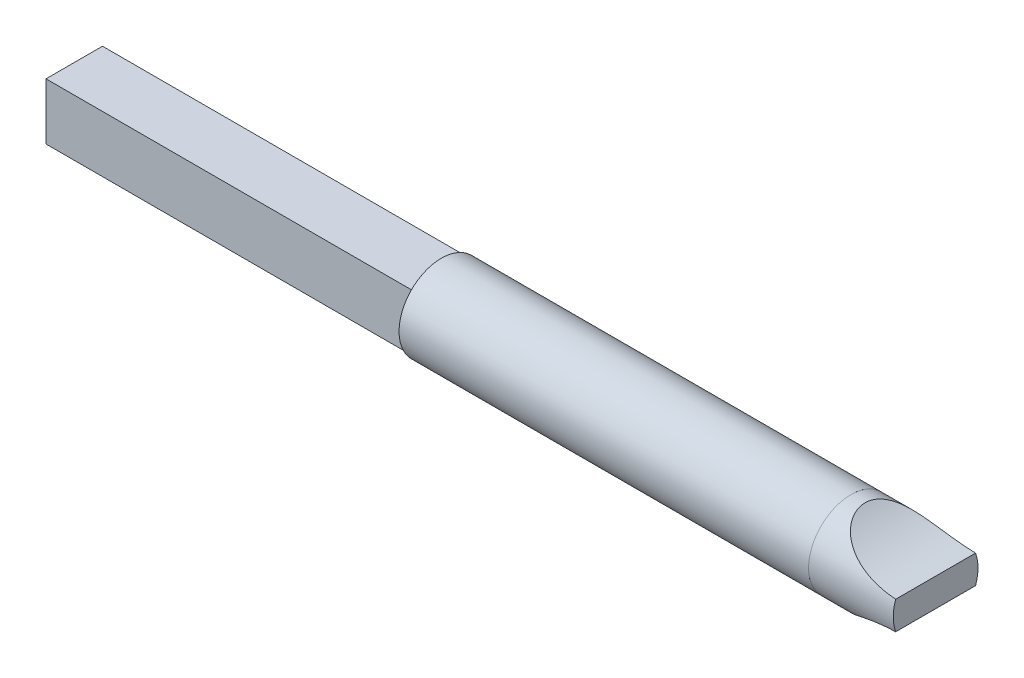
ISO-10303-21;
HEADER;
FILE_DESCRIPTION(('STEP AP214'),'2;1');
FILE_NAME('part.step','',(''),(''),'','','');
FILE_SCHEMA(('AUTOMOTIVE_DESIGN { 1 0 10303 214 1 1 1 1 }'));
ENDSEC;
DATA;
#1=APPLICATION_CONTEXT('core data for automotive mechanical design processes');
#2=APPLICATION_PROTOCOL_DEFINITION('international standard','automotive_design',2000,#1);
#3=PRODUCT_CONTEXT('',#1,'mechanical');
#4=PRODUCT('Part','Part','',(#3));
#5=PRODUCT_RELATED_PRODUCT_CATEGORY('part','',(#4));
#6=PRODUCT_DEFINITION_FORMATION('','',#4);
#7=PRODUCT_DEFINITION_CONTEXT('part definition',#1,'design');
#8=PRODUCT_DEFINITION('design','',#6,#7);
#9=PRODUCT_DEFINITION_SHAPE('','',#8);
#10=(LENGTH_UNIT() NAMED_UNIT(*) SI_UNIT(.MILLI.,.METRE.));
#11=(NAMED_UNIT(*) PLANE_ANGLE_UNIT() SI_UNIT($,.RADIAN.));
#12=(NAMED_UNIT(*) SI_UNIT($,.STERADIAN.) SOLID_ANGLE_UNIT());
#13=UNCERTAINTY_MEASURE_WITH_UNIT(LENGTH_MEASURE(1.E-05),#10,'distance_accuracy_value','');
#14=(GEOMETRIC_REPRESENTATION_CONTEXT(3) GLOBAL_UNCERTAINTY_ASSIGNED_CONTEXT((#13)) GLOBAL_UNIT_ASSIGNED_CONTEXT((#10,
#11,#12)) REPRESENTATION_CONTEXT('',''));
#15=CARTESIAN_POINT('',(0.,0.,0.));
#16=DIRECTION('',(0.,0.,1.));
#17=DIRECTION('',(1.,0.,0.));
#18=AXIS2_PLACEMENT_3D('',#15,#16,#17);
#19=CARTESIAN_POINT('',(65.,0.,0.));
#20=DIRECTION('',(1.,0.,0.));
#21=DIRECTION('',(0.,0.,-1.));
#22=AXIS2_PLACEMENT_3D('',#19,#20,#21);
#23=PLANE('',#22);
#24=CARTESIAN_POINT('',(65.,0.,0.));
#25=DIRECTION('',(1.,0.,0.));
#26=DIRECTION('',(0.,0.,-1.));
#27=AXIS2_PLACEMENT_3D('',#24,#25,#26);
#28=CIRCLE('',#27,3.);
#29=CARTESIAN_POINT('',(65.,0.999999999999999,2.82842712474619));
#30=VERTEX_POINT('',#29);
#31=CARTESIAN_POINT('',(65.,-0.999999999999999,2.82842712474619));
#32=VERTEX_POINT('',#31);
#33=EDGE_CURVE('E93',#30,#32,#28,.T.);
#34=ORIENTED_EDGE('',*,*,#33,.T.);
#35=DIRECTION('',(0.,0.,-1.));
#36=VECTOR('',#35,1.);
#37=CARTESIAN_POINT('',(65.,-0.999999999999999,16.7403810567666));
#38=LINE('',#37,#36);
#39=CARTESIAN_POINT('',(65.,-0.999999999999999,-2.82842712474619));
#40=VERTEX_POINT('',#39);
#41=EDGE_CURVE('E13',#32,#40,#38,.T.);
#42=ORIENTED_EDGE('',*,*,#41,.T.);
#43=CARTESIAN_POINT('',(65.,0.999999999999999,-2.82842712474619));
#44=VERTEX_POINT('',#43);
#45=EDGE_CURVE('E82',#40,#44,#28,.T.);
#46=ORIENTED_EDGE('',*,*,#45,.T.);
#47=DIRECTION('',(0.,0.,-1.));
#48=VECTOR('',#47,1.);
#49=CARTESIAN_POINT('',(65.,0.999999999999999,85.6895070311973));
#50=LINE('',#49,#48);
#51=EDGE_CURVE('E68',#30,#44,#50,.T.);
#52=ORIENTED_EDGE('',*,*,#51,.F.);
#53=EDGE_LOOP('',(#34,#42,#46,#52));
#54=FACE_BOUND('',#53,.T.);
#55=ADVANCED_FACE('F58',(#54),#23,.T.);
#56=CARTESIAN_POINT('',(65.,0.,0.));
#57=DIRECTION('',(-1.,0.,0.));
#58=DIRECTION('',(0.,0.,1.));
#59=AXIS2_PLACEMENT_3D('',#56,#57,#58);
#60=CYLINDRICAL_SURFACE('',#59,3.);
#61=CARTESIAN_POINT('',(59.,0.,0.));
#62=DIRECTION('',(1.,0.,0.));
#63=DIRECTION('',(0.,0.,-1.));
#64=AXIS2_PLACEMENT_3D('',#61,#62,#63);
#65=CIRCLE('',#64,3.);
#66=CARTESIAN_POINT('',(59.,0.,-3.));
#67=VERTEX_POINT('',#66);
#68=EDGE_CURVE('E63',#67,#67,#65,.T.);
#69=ORIENTED_EDGE('',*,*,#68,.T.);
#70=EDGE_LOOP('',(#69));
#71=FACE_BOUND('',#70,.T.);
#72=ORIENTED_EDGE('',*,*,#45,.F.);
#73=CARTESIAN_POINT('',(65.,-0.999999999999999,-2.82842712474619));
#74=CARTESIAN_POINT('',(64.8977227981435,-1.00380811025547,-2.82707086786133));
#75=CARTESIAN_POINT('',(64.795527259305,-1.00958177474734,-2.82503051619203));
#76=CARTESIAN_POINT('',(64.5914656067899,-1.0250405728982,-2.81946342968028));
#77=CARTESIAN_POINT('',(64.4895995183651,-1.03472599954653,-2.81593658349915));
#78=CARTESIAN_POINT('',(64.2861768446936,-1.05801115940411,-2.80726990181661));
#79=CARTESIAN_POINT('',(64.1846212730786,-1.07161861290351,-2.80212688314985));
#80=CARTESIAN_POINT('',(63.982220702239,-1.10270170833027,-2.79004006186386));
#81=CARTESIAN_POINT('',(63.8813756861871,-1.12017725833498,-2.78309630203733));
#82=CARTESIAN_POINT('',(63.5779497195673,-1.17877303856045,-2.75904421548047));
#83=CARTESIAN_POINT('',(63.3767122683805,-1.22580674736097,-2.73879983107694));
#84=CARTESIAN_POINT('',(62.9799304253088,-1.33483431406507,-2.68735141458544));
#85=CARTESIAN_POINT('',(62.7843801324206,-1.3968119967429,-2.65615921579512));
#86=CARTESIAN_POINT('',(62.4840466705774,-1.50471114043191,-2.59573219360949));
#87=CARTESIAN_POINT('',(62.3765706745318,-1.54599076847483,-2.57148072705159));
#88=CARTESIAN_POINT('',(62.1646848521842,-1.63260915278527,-2.51737990580141));
#89=CARTESIAN_POINT('',(62.0602750044021,-1.67794788060741,-2.48753059033616));
#90=CARTESIAN_POINT('',(61.8555373058913,-1.77201946969617,-2.42141281198766));
#91=CARTESIAN_POINT('',(61.7551963472498,-1.82073978526117,-2.38516737966097));
#92=CARTESIAN_POINT('',(61.5590357575676,-1.92099007929812,-2.30519056230202));
#93=CARTESIAN_POINT('',(61.4632148788322,-1.97251927385836,-2.26146125867886));
#94=CARTESIAN_POINT('',(61.2305281930951,-2.10366530034094,-2.1414921043368));
#95=CARTESIAN_POINT('',(61.0970003960334,-2.18448416734252,-2.05990997351978));
#96=CARTESIAN_POINT('',(60.8462371881295,-2.34570432532295,-1.87422174906412));
#97=CARTESIAN_POINT('',(60.7289806102892,-2.42610602531807,-1.77014537758295));
#98=CARTESIAN_POINT('',(60.5400573723089,-2.56216148065085,-1.56425107015925));
#99=CARTESIAN_POINT('',(60.4640960587651,-2.61927156832691,-1.4673534818394));
#100=CARTESIAN_POINT('',(60.3272230765855,-2.72540176684354,-1.25926841781172));
#101=CARTESIAN_POINT('',(60.26630659635,-2.77442446250321,-1.14808552813084));
#102=CARTESIAN_POINT('',(60.1878721779583,-2.83897159847734,-0.971716246649912));
#103=CARTESIAN_POINT('',(60.1638022219837,-2.85906215517796,-0.911020083943747));
#104=CARTESIAN_POINT('',(60.12036920282,-2.89566940325192,-0.786938896605101));
#105=CARTESIAN_POINT('',(60.1010037328422,-2.91218792158297,-0.723555266443302));
#106=CARTESIAN_POINT('',(60.0672088904725,-2.94122528450278,-0.594607788821951));
#107=CARTESIAN_POINT('',(60.0527780347448,-2.95374533094973,-0.529044603046281));
#108=CARTESIAN_POINT('',(60.0290152085488,-2.97446138110034,-0.396355405765538));
#109=CARTESIAN_POINT('',(60.0196824613661,-2.98265804347995,-0.329229633951497));
#110=CARTESIAN_POINT('',(60.0013233084163,-2.99880673062,-0.144574555393579));
#111=CARTESIAN_POINT('',(59.9975019284118,-3.00220517782331,-0.0260492524862019));
#112=CARTESIAN_POINT('',(60.0056875899966,-2.99497674359002,0.209921452982817));
#113=CARTESIAN_POINT('',(60.0176890027099,-2.98435484981505,0.327367224617935));
#114=CARTESIAN_POINT('',(60.0560426585103,-2.95088403940189,0.551821677584054));
#115=CARTESIAN_POINT('',(60.0816398298329,-2.92867946074306,0.659057938917898));
#116=CARTESIAN_POINT('',(60.1458360111995,-2.87406268156952,0.866780727021696));
#117=CARTESIAN_POINT('',(60.1844362206149,-2.84164953945753,0.967266630127722));
#118=CARTESIAN_POINT('',(60.2762008014568,-2.76650106122038,1.1654983967686));
#119=CARTESIAN_POINT('',(60.3301096127213,-2.72325690198535,1.26270373119218));
#120=CARTESIAN_POINT('',(60.4496211240355,-2.63041049719956,1.44621586929751));
#121=CARTESIAN_POINT('',(60.5152297180502,-2.58080505059616,1.53251714225907));
#122=CARTESIAN_POINT('',(60.6906986289463,-2.45293668572772,1.7329982996199));
#123=CARTESIAN_POINT('',(60.8066082664682,-2.37242322736715,1.84045684577245));
#124=CARTESIAN_POINT('',(61.0554464704668,-2.21030337943229,2.03234797611815));
#125=CARTESIAN_POINT('',(61.188407757765,-2.12869516598634,2.11673528693953));
#126=CARTESIAN_POINT('',(61.4304252604822,-1.9903404895868,2.24610532559762));
#127=CARTESIAN_POINT('',(61.5366127735636,-1.93268405428998,2.29561886204983));
#128=CARTESIAN_POINT('',(61.7546398456268,-1.82081336861136,2.3853273141011));
#129=CARTESIAN_POINT('',(61.8664821220005,-1.76660080196242,2.42551769661858));
#130=CARTESIAN_POINT('',(62.0951906977798,-1.66238392331899,2.49810534283928));
#131=CARTESIAN_POINT('',(62.2120773055032,-1.61239960539952,2.53046679463623));
#132=CARTESIAN_POINT('',(62.449513986275,-1.51757693312487,2.58844391654974));
#133=CARTESIAN_POINT('',(62.5700638285343,-1.47273825543337,2.61406001065506));
#134=CARTESIAN_POINT('',(62.8768864154948,-1.36704334701429,2.67141687585913));
#135=CARTESIAN_POINT('',(63.0650899436014,-1.30980132801685,2.69953736611841));
#136=CARTESIAN_POINT('',(63.4464411296706,-1.20911800194212,2.74610726092713));
#137=CARTESIAN_POINT('',(63.6395926582002,-1.16568787896308,2.76454883585153));
#138=CARTESIAN_POINT('',(63.9304013681702,-1.11157353025386,2.78653234010346));
#139=CARTESIAN_POINT('',(64.0268742382302,-1.09544524432728,2.79288987148859));
#140=CARTESIAN_POINT('',(64.2204450950724,-1.06672521649173,2.80398594440313));
#141=CARTESIAN_POINT('',(64.3175430927368,-1.05413353631854,2.80872445767092));
#142=CARTESIAN_POINT('',(64.512041475665,-1.03253590709335,2.81673646808089));
#143=CARTESIAN_POINT('',(64.6094411546985,-1.02352440544821,2.82001223482112));
#144=CARTESIAN_POINT('',(64.8045356508017,-1.00907679788506,2.82520984672075));
#145=CARTESIAN_POINT('',(64.9022304497444,-1.0036404766838,2.82713177340355));
#146=CARTESIAN_POINT('',(65.,-1.,2.82842712474619));
#147=B_SPLINE_CURVE_WITH_KNOTS('',3,(#73,#74,#75,#76,#77,#78,#79,#80,#81,#82,#83,#84,#85,#86,
#87,#88,#89,#90,#91,#92,#93,#94,#95,#96,#97,#98,#99,#100,#101,#102,#103,#104,#105,#106,#107,
#108,#109,#110,#111,#112,#113,#114,#115,#116,#117,#118,#119,#120,#121,#122,#123,#124,#125,#126,
#127,#128,#129,#130,#131,#132,#133,#134,#135,#136,#137,#138,#139,#140,#141,#142,#143,#144,#145,
#146),.UNSPECIFIED.,.F.,.F.,(4,2,2,2,2,2,2,2,2,2,2,2,2,2,2,2,2,2,2,2,2,2,2,2,2,2,2,2,2,2,2,2,2,
2,2,2,4),(0.,0.307050408899966,0.614123820011669,0.921805865046132,1.22948059901477,
1.85155946724391,2.472968001767,2.82573592523854,3.17850137677392,3.53002161857829,
3.8814442542232,4.40796850375418,4.9338012521362,5.33945407724632,5.74497699902912,
5.94966543736673,6.15424893666643,6.35877088438175,6.56326166377438,6.91714772940425,
7.27090793587491,7.6068089749955,7.9427410053697,8.2991532105135,8.65574547422932,
9.18491554901294,9.71511669593626,10.1063491285275,10.4977713883607,10.8909516410862,
11.2841071740222,11.8793581755806,12.4750899579341,12.7690796051313,13.0630743839589,
13.3566114017123,13.6501307422064),.UNSPECIFIED.);
#148=EDGE_CURVE('E76',#40,#32,#147,.T.);
#149=ORIENTED_EDGE('',*,*,#148,.T.);
#150=ORIENTED_EDGE('',*,*,#33,.F.);
#151=CARTESIAN_POINT('',(65.,0.999999999999999,-2.82842712474619));
#152=CARTESIAN_POINT('',(64.8977227981435,1.00380811025547,-2.82707086786133));
#153=CARTESIAN_POINT('',(64.795527259305,1.00958177474734,-2.82503051619203));
#154=CARTESIAN_POINT('',(64.5914656067898,1.02504057289821,-2.81946342968027));
#155=CARTESIAN_POINT('',(64.4895995183651,1.03472599954653,-2.81593658349915));
#156=CARTESIAN_POINT('',(64.2861768446936,1.05801115940411,-2.80726990181661));
#157=CARTESIAN_POINT('',(64.1846212730786,1.07161861290352,-2.80212688314985));
#158=CARTESIAN_POINT('',(63.9822207022389,1.10270170833027,-2.79004006186386));
#159=CARTESIAN_POINT('',(63.8813756861871,1.12017725833499,-2.78309630203733));
#160=CARTESIAN_POINT('',(63.5779497195673,1.17877303856046,-2.75904421548047));
#161=CARTESIAN_POINT('',(63.3767122683805,1.22580674736098,-2.73879983107694));
#162=CARTESIAN_POINT('',(62.9799304253088,1.33483431406508,-2.68735141458544));
#163=CARTESIAN_POINT('',(62.7843801324206,1.39681199674291,-2.65615921579512));
#164=CARTESIAN_POINT('',(62.4840466705774,1.50471114043192,-2.59573219360948));
#165=CARTESIAN_POINT('',(62.3765706745318,1.54599076847483,-2.57148072705159));
#166=CARTESIAN_POINT('',(62.1646848521842,1.63260915278527,-2.51737990580141));
#167=CARTESIAN_POINT('',(62.0602750044021,1.67794788060741,-2.48753059033616));
#168=CARTESIAN_POINT('',(61.8555373058913,1.77201946969617,-2.42141281198766));
#169=CARTESIAN_POINT('',(61.7551963472498,1.82073978526118,-2.38516737966096));
#170=CARTESIAN_POINT('',(61.5590357575676,1.92099007929813,-2.30519056230202));
#171=CARTESIAN_POINT('',(61.4632148788322,1.97251927385837,-2.26146125867885));
#172=CARTESIAN_POINT('',(61.2305281930951,2.10366530034094,-2.14149210433679));
#173=CARTESIAN_POINT('',(61.0970003960334,2.18448416734252,-2.05990997351978));
#174=CARTESIAN_POINT('',(60.8462371881295,2.34570432532295,-1.87422174906412));
#175=CARTESIAN_POINT('',(60.7289806102892,2.42610602531807,-1.77014537758295));
#176=CARTESIAN_POINT('',(60.5400573723089,2.56216148065086,-1.56425107015925));
#177=CARTESIAN_POINT('',(60.4640960587651,2.61927156832691,-1.4673534818394));
#178=CARTESIAN_POINT('',(60.3272230765855,2.72540176684354,-1.25926841781171));
#179=CARTESIAN_POINT('',(60.26630659635,2.77442446250322,-1.14808552813083));
#180=CARTESIAN_POINT('',(60.1878721779583,2.83897159847735,-0.971716246649902));
#181=CARTESIAN_POINT('',(60.1638022219837,2.85906215517796,-0.911020083943737));
#182=CARTESIAN_POINT('',(60.12036920282,2.89566940325192,-0.786938896605089));
#183=CARTESIAN_POINT('',(60.1010037328422,2.91218792158298,-0.723555266443289));
#184=CARTESIAN_POINT('',(60.0672088904725,2.94122528450278,-0.594607788821938));
#185=CARTESIAN_POINT('',(60.0527780347448,2.95374533094974,-0.52904460304627));
#186=CARTESIAN_POINT('',(60.0290152085488,2.97446138110034,-0.396355405765528));
#187=CARTESIAN_POINT('',(60.0196824613661,2.98265804347995,-0.329229633951487));
#188=CARTESIAN_POINT('',(60.0013233084163,2.99880673062,-0.144574555393569));
#189=CARTESIAN_POINT('',(59.9975019284118,3.00220517782331,-0.026049252486193));
#190=CARTESIAN_POINT('',(60.0056875899966,2.99497674359002,0.209921452982825));
#191=CARTESIAN_POINT('',(60.0176890027099,2.98435484981505,0.327367224617943));
#192=CARTESIAN_POINT('',(60.0560426585103,2.95088403940189,0.551821677584061));
#193=CARTESIAN_POINT('',(60.0816398298329,2.92867946074306,0.659057938917903));
#194=CARTESIAN_POINT('',(60.1458360111995,2.87406268156952,0.8667807270217));
#195=CARTESIAN_POINT('',(60.1844362206149,2.84164953945752,0.967266630127728));
#196=CARTESIAN_POINT('',(60.2762008014568,2.76650106122038,1.1654983967686));
#197=CARTESIAN_POINT('',(60.3301096127213,2.72325690198535,1.26270373119219));
#198=CARTESIAN_POINT('',(60.4496211240355,2.63041049719955,1.44621586929752));
#199=CARTESIAN_POINT('',(60.5152297180502,2.58080505059615,1.53251714225908));
#200=CARTESIAN_POINT('',(60.6906986289463,2.45293668572772,1.73299829961991));
#201=CARTESIAN_POINT('',(60.8066082664682,2.37242322736715,1.84045684577245));
#202=CARTESIAN_POINT('',(61.0554464704669,2.21030337943229,2.03234797611815));
#203=CARTESIAN_POINT('',(61.188407757765,2.12869516598633,2.11673528693954));
#204=CARTESIAN_POINT('',(61.4304252604822,1.99034048958679,2.24610532559762));
#205=CARTESIAN_POINT('',(61.5366127735636,1.93268405428997,2.29561886204983));
#206=CARTESIAN_POINT('',(61.7546398456268,1.82081336861135,2.3853273141011));
#207=CARTESIAN_POINT('',(61.8664821220005,1.76660080196242,2.42551769661859));
#208=CARTESIAN_POINT('',(62.0951906977798,1.66238392331898,2.49810534283928));
#209=CARTESIAN_POINT('',(62.2120773055032,1.61239960539952,2.53046679463623));
#210=CARTESIAN_POINT('',(62.4495139862751,1.51757693312487,2.58844391654974));
#211=CARTESIAN_POINT('',(62.5700638285344,1.47273825543336,2.61406001065506));
#212=CARTESIAN_POINT('',(62.8768864154948,1.36704334701428,2.67141687585913));
#213=CARTESIAN_POINT('',(63.0650899436014,1.30980132801685,2.69953736611841));
#214=CARTESIAN_POINT('',(63.4464411296707,1.20911800194212,2.74610726092713));
#215=CARTESIAN_POINT('',(63.6395926582002,1.16568787896307,2.76454883585153));
#216=CARTESIAN_POINT('',(63.9304013681703,1.11157353025385,2.78653234010346));
#217=CARTESIAN_POINT('',(64.0268742382302,1.09544524432727,2.79288987148859));
#218=CARTESIAN_POINT('',(64.2204450950724,1.06672521649173,2.80398594440313));
#219=CARTESIAN_POINT('',(64.3175430927368,1.05413353631854,2.80872445767092));
#220=CARTESIAN_POINT('',(64.512041475665,1.03253590709336,2.81673646808089));
#221=CARTESIAN_POINT('',(64.6094411546986,1.02352440544821,2.82001223482112));
#222=CARTESIAN_POINT('',(64.8045356508018,1.00907679788506,2.82520984672075));
#223=CARTESIAN_POINT('',(64.9022304497444,1.0036404766838,2.82713177340355));
#224=CARTESIAN_POINT('',(65.,0.999999999999999,2.82842712474619));
#225=B_SPLINE_CURVE_WITH_KNOTS('',3,(#151,#152,#153,#154,#155,#156,#157,#158,#159,#160,#161,
#162,#163,#164,#165,#166,#167,#168,#169,#170,#171,#172,#173,#174,#175,#176,#177,#178,#179,#180,
#181,#182,#183,#184,#185,#186,#187,#188,#189,#190,#191,#192,#193,#194,#195,#196,#197,#198,#199,
#200,#201,#202,#203,#204,#205,#206,#207,#208,#209,#210,#211,#212,#213,#214,#215,#216,#217,#218,
#219,#220,#221,#222,#223,#224),.UNSPECIFIED.,.F.,.F.,(4,2,2,2,2,2,2,2,2,2,2,2,2,2,2,2,2,2,2,2,2,
2,2,2,2,2,2,2,2,2,2,2,2,2,2,2,4),(0.,0.307050408899966,0.614123820011683,0.921805865046146,
1.22948059901477,1.85155946724391,2.472968001767,2.82573592523853,3.17850137677391,
3.53002161857829,3.88144425422319,4.40796850375417,4.93380125213619,5.33945407724631,
5.74497699902911,5.94966543736673,6.15424893666643,6.35877088438175,6.56326166377437,
6.91714772940424,7.2709079358749,7.60680897499549,7.94274100536969,8.2991532105135,
8.65574547422931,9.18491554901294,9.71511669593626,10.1063491285275,10.4977713883607,
10.8909516410862,11.2841071740222,11.8793581755806,12.4750899579341,12.7690796051313,
13.0630743839588,13.3566114017123,13.6501307422064),.UNSPECIFIED.);
#226=EDGE_CURVE('E91',#44,#30,#225,.T.);
#227=ORIENTED_EDGE('',*,*,#226,.F.);
#228=EDGE_LOOP('',(#72,#149,#150,#227));
#229=FACE_BOUND('',#228,.T.);
#230=ADVANCED_FACE('F60',(#71,#229),#60,.T.);
#231=CARTESIAN_POINT('',(59.,0.,0.));
#232=DIRECTION('',(1.,0.,0.));
#233=DIRECTION('',(0.,0.,-1.));
#234=AXIS2_PLACEMENT_3D('',#231,#232,#233);
#235=PLANE('',#234);
#236=ORIENTED_EDGE('',*,*,#68,.F.);
#237=EDGE_LOOP('',(#236));
#238=FACE_BOUND('',#237,.T.);
#239=ADVANCED_FACE('F108',(#238),#235,.F.);
#240=CARTESIAN_POINT('',(65.2977823730406,8.99445593260143,85.6895070311973));
#241=DIRECTION('',(0.,0.,-1.));
#242=DIRECTION('',(-1.,0.,0.));
#243=AXIS2_PLACEMENT_3D('',#240,#241,#242);
#244=CYLINDRICAL_SURFACE('',#243,8.);
#245=ORIENTED_EDGE('',*,*,#51,.T.);
#246=ORIENTED_EDGE('',*,*,#226,.T.);
#247=EDGE_LOOP('',(#245,#246));
#248=FACE_BOUND('',#247,.T.);
#249=ADVANCED_FACE('F103',(#248),#244,.F.);
#250=CARTESIAN_POINT('',(65.2977823730406,-8.99445593260143,16.7403810567666));
#251=DIRECTION('',(0.,0.,-1.));
#252=DIRECTION('',(-1.,0.,0.));
#253=AXIS2_PLACEMENT_3D('',#250,#251,#252);
#254=CYLINDRICAL_SURFACE('',#253,8.);
#255=ORIENTED_EDGE('',*,*,#148,.F.);
#256=ORIENTED_EDGE('',*,*,#41,.F.);
#257=EDGE_LOOP('',(#255,#256));
#258=FACE_BOUND('',#257,.T.);
#259=ADVANCED_FACE('F89',(#258),#254,.F.);
#260=CLOSED_SHELL('',(#55,#230,#239,#249,#259));
#261=MANIFOLD_SOLID_BREP('B2',#260);
#262=CARTESIAN_POINT('',(30.,0.,0.));
#263=DIRECTION('',(1.,0.,0.));
#264=DIRECTION('',(0.,0.,-1.));
#265=AXIS2_PLACEMENT_3D('',#262,#263,#264);
#266=PLANE('',#265);
#267=DIRECTION('',(0.,0.,-1.));
#268=VECTOR('',#267,1.);
#269=CARTESIAN_POINT('',(30.,2.,-2.));
#270=LINE('',#269,#268);
#271=CARTESIAN_POINT('',(30.,2.,2.));
#272=VERTEX_POINT('',#271);
#273=CARTESIAN_POINT('',(30.,2.,-2.));
#274=VERTEX_POINT('',#273);
#275=EDGE_CURVE('E213',#272,#274,#270,.T.);
#276=ORIENTED_EDGE('',*,*,#275,.F.);
#277=DIRECTION('',(0.,1.,0.));
#278=VECTOR('',#277,1.);
#279=CARTESIAN_POINT('',(30.,2.,2.));
#280=LINE('',#279,#278);
#281=CARTESIAN_POINT('',(30.,-2.,2.));
#282=VERTEX_POINT('',#281);
#283=EDGE_CURVE('E178',#282,#272,#280,.T.);
#284=ORIENTED_EDGE('',*,*,#283,.F.);
#285=DIRECTION('',(0.,0.,1.));
#286=VECTOR('',#285,1.);
#287=CARTESIAN_POINT('',(30.,-2.,-2.));
#288=LINE('',#287,#286);
#289=CARTESIAN_POINT('',(30.,-2.,-2.));
#290=VERTEX_POINT('',#289);
#291=EDGE_CURVE('E219',#290,#282,#288,.T.);
#292=ORIENTED_EDGE('',*,*,#291,.F.);
#293=DIRECTION('',(0.,-1.,0.));
#294=VECTOR('',#293,1.);
#295=CARTESIAN_POINT('',(30.,2.,-2.));
#296=LINE('',#295,#294);
#297=EDGE_CURVE('E226',#274,#290,#296,.T.);
#298=ORIENTED_EDGE('',*,*,#297,.F.);
#299=EDGE_LOOP('',(#276,#284,#292,#298));
#300=FACE_BOUND('',#299,.T.);
#301=CARTESIAN_POINT('',(30.,0.,0.));
#302=DIRECTION('',(1.,0.,0.));
#303=DIRECTION('',(0.,0.,-1.));
#304=AXIS2_PLACEMENT_3D('',#301,#302,#303);
#305=CIRCLE('',#304,3.);
#306=CARTESIAN_POINT('',(30.,0.,3.));
#307=VERTEX_POINT('',#306);
#308=EDGE_CURVE('E159',#307,#307,#305,.T.);
#309=ORIENTED_EDGE('',*,*,#308,.F.);
#310=EDGE_LOOP('',(#309));
#311=FACE_BOUND('',#310,.T.);
#312=ADVANCED_FACE('F155',(#300,#311),#266,.F.);
#313=CARTESIAN_POINT('',(59.,0.,0.));
#314=DIRECTION('',(-1.,0.,0.));
#315=DIRECTION('',(0.,0.,1.));
#316=AXIS2_PLACEMENT_3D('',#313,#314,#315);
#317=CYLINDRICAL_SURFACE('',#316,3.);
#318=CARTESIAN_POINT('',(59.,0.,0.));
#319=DIRECTION('',(1.,0.,0.));
#320=DIRECTION('',(0.,0.,-1.));
#321=AXIS2_PLACEMENT_3D('',#318,#319,#320);
#322=CIRCLE('',#321,3.);
#323=CARTESIAN_POINT('',(59.,0.,3.));
#324=VERTEX_POINT('',#323);
#325=EDGE_CURVE('E56',#324,#324,#322,.T.);
#326=CARTESIAN_POINT('',(59.,0.,3.));
#327=CARTESIAN_POINT('',(58.6979166666667,0.,3.));
#328=CARTESIAN_POINT('',(58.3958333333333,0.,3.));
#329=CARTESIAN_POINT('',(57.7916666666667,0.,3.));
#330=CARTESIAN_POINT('',(57.4895833333333,0.,3.));
#331=CARTESIAN_POINT('',(56.8854166666667,0.,3.));
#332=CARTESIAN_POINT('',(56.5833333333333,0.,3.));
#333=CARTESIAN_POINT('',(55.9791666666667,0.,3.));
#334=CARTESIAN_POINT('',(55.6770833333333,0.,3.));
#335=CARTESIAN_POINT('',(55.0729166666667,0.,3.));
#336=CARTESIAN_POINT('',(54.7708333333333,0.,3.));
#337=CARTESIAN_POINT('',(54.1666666666667,0.,3.));
#338=CARTESIAN_POINT('',(53.8645833333333,0.,3.));
#339=CARTESIAN_POINT('',(53.2604166666667,0.,3.));
#340=CARTESIAN_POINT('',(52.9583333333333,0.,3.));
#341=CARTESIAN_POINT('',(52.3541666666667,0.,3.));
#342=CARTESIAN_POINT('',(52.0520833333333,0.,3.));
#343=CARTESIAN_POINT('',(51.4479166666667,0.,3.));
#344=CARTESIAN_POINT('',(51.1458333333333,0.,3.));
#345=CARTESIAN_POINT('',(50.5416666666667,0.,3.));
#346=CARTESIAN_POINT('',(50.2395833333333,0.,3.));
#347=CARTESIAN_POINT('',(49.6354166666667,0.,3.));
#348=CARTESIAN_POINT('',(49.3333333333333,0.,3.));
#349=CARTESIAN_POINT('',(48.7291666666667,0.,3.));
#350=CARTESIAN_POINT('',(48.4270833333333,0.,3.));
#351=CARTESIAN_POINT('',(47.8229166666667,0.,3.));
#352=CARTESIAN_POINT('',(47.5208333333333,0.,3.));
#353=CARTESIAN_POINT('',(46.9166666666667,0.,3.));
#354=CARTESIAN_POINT('',(46.6145833333333,0.,3.));
#355=CARTESIAN_POINT('',(46.0104166666667,0.,3.));
#356=CARTESIAN_POINT('',(45.7083333333333,0.,3.));
#357=CARTESIAN_POINT('',(45.1041666666667,0.,3.));
#358=CARTESIAN_POINT('',(44.8020833333333,0.,3.));
#359=CARTESIAN_POINT('',(44.1979166666667,0.,3.));
#360=CARTESIAN_POINT('',(43.8958333333333,0.,3.));
#361=CARTESIAN_POINT('',(43.2916666666667,0.,3.));
#362=CARTESIAN_POINT('',(42.9895833333333,0.,3.));
#363=CARTESIAN_POINT('',(42.3854166666667,0.,3.));
#364=CARTESIAN_POINT('',(42.0833333333333,0.,3.));
#365=CARTESIAN_POINT('',(41.4791666666667,0.,3.));
#366=CARTESIAN_POINT('',(41.1770833333333,0.,3.));
#367=CARTESIAN_POINT('',(40.5729166666667,0.,3.));
#368=CARTESIAN_POINT('',(40.2708333333333,0.,3.));
#369=CARTESIAN_POINT('',(39.6666666666667,0.,3.));
#370=CARTESIAN_POINT('',(39.3645833333333,0.,3.));
#371=CARTESIAN_POINT('',(38.7604166666667,0.,3.));
#372=CARTESIAN_POINT('',(38.4583333333333,0.,3.));
#373=CARTESIAN_POINT('',(37.8541666666667,0.,3.));
#374=CARTESIAN_POINT('',(37.5520833333333,0.,3.));
#375=CARTESIAN_POINT('',(36.9479166666667,0.,3.));
#376=CARTESIAN_POINT('',(36.6458333333333,0.,3.));
#377=CARTESIAN_POINT('',(36.0416666666667,0.,3.));
#378=CARTESIAN_POINT('',(35.7395833333333,0.,3.));
#379=CARTESIAN_POINT('',(35.1354166666667,0.,3.));
#380=CARTESIAN_POINT('',(34.8333333333333,0.,3.));
#381=CARTESIAN_POINT('',(34.2291666666667,0.,3.));
#382=CARTESIAN_POINT('',(33.9270833333333,0.,3.));
#383=CARTESIAN_POINT('',(33.3229166666667,0.,3.));
#384=CARTESIAN_POINT('',(33.0208333333333,0.,3.));
#385=CARTESIAN_POINT('',(32.4166666666667,0.,3.));
#386=CARTESIAN_POINT('',(32.1145833333333,0.,3.));
#387=CARTESIAN_POINT('',(31.5104166666667,0.,3.));
#388=CARTESIAN_POINT('',(31.2083333333333,0.,3.));
#389=CARTESIAN_POINT('',(30.6041666666667,0.,3.));
#390=CARTESIAN_POINT('',(30.3020833333333,0.,3.));
#391=CARTESIAN_POINT('',(30.,0.,3.));
#392=B_SPLINE_CURVE_WITH_KNOTS('',3,(#326,#327,#328,#329,#330,#331,#332,#333,#334,#335,#336,
#337,#338,#339,#340,#341,#342,#343,#344,#345,#346,#347,#348,#349,#350,#351,#352,#353,#354,#355,
#356,#357,#358,#359,#360,#361,#362,#363,#364,#365,#366,#367,#368,#369,#370,#371,#372,#373,#374,
#375,#376,#377,#378,#379,#380,#381,#382,#383,#384,#385,#386,#387,#388,#389,#390,#391),
.UNSPECIFIED.,.F.,.F.,(4,2,2,2,2,2,2,2,2,2,2,2,2,2,2,2,2,2,2,2,2,2,2,2,2,2,2,2,2,2,2,2,4),(0.,
0.906250000000004,1.8125,2.71875000000001,3.625,4.53125,5.4375,6.34375,7.25000000000001,8.15625,
9.0625,9.96875,10.875,11.78125,12.6875,13.59375,14.5,15.40625,16.3125,17.21875,18.125,19.03125,
19.9375,20.84375,21.75,22.65625,23.5625,24.46875,25.375,26.28125,27.1875,28.09375,29.),.UNSPECIFIED.);
#393=EDGE_CURVE('BSEAM157',#324,#307,#392,.T.);
#394=ORIENTED_EDGE('',*,*,#325,.F.);
#395=ORIENTED_EDGE('',*,*,#308,.T.);
#396=ORIENTED_EDGE('',*,*,#393,.T.);
#397=ORIENTED_EDGE('',*,*,#393,.F.);
#398=EDGE_LOOP('',(#394,#396,#395,#397));
#399=FACE_BOUND('',#398,.T.);
#400=ADVANCED_FACE('F157',(#399),#317,.T.);
#401=CARTESIAN_POINT('',(59.,0.,0.));
#402=DIRECTION('',(1.,0.,0.));
#403=DIRECTION('',(0.,0.,-1.));
#404=AXIS2_PLACEMENT_3D('',#401,#402,#403);
#405=PLANE('',#404);
#406=ORIENTED_EDGE('',*,*,#325,.T.);
#407=EDGE_LOOP('',(#406));
#408=FACE_BOUND('',#407,.T.);
#409=ADVANCED_FACE('F242',(#408),#405,.T.);
#410=CARTESIAN_POINT('',(30.,2.,2.));
#411=DIRECTION('',(0.,0.,1.));
#412=DIRECTION('',(0.,-1.,0.));
#413=AXIS2_PLACEMENT_3D('',#410,#411,#412);
#414=PLANE('',#413);
#415=DIRECTION('',(0.,1.,0.));
#416=VECTOR('',#415,1.);
#417=CARTESIAN_POINT('',(4.,-2.,2.));
#418=LINE('',#417,#416);
#419=CARTESIAN_POINT('',(4.,-2.,2.));
#420=VERTEX_POINT('',#419);
#421=CARTESIAN_POINT('',(4.,2.,2.));
#422=VERTEX_POINT('',#421);
#423=EDGE_CURVE('E170',#420,#422,#418,.T.);
#424=ORIENTED_EDGE('',*,*,#423,.F.);
#425=DIRECTION('',(-1.,0.,0.));
#426=VECTOR('',#425,1.);
#427=CARTESIAN_POINT('',(30.,-2.,2.));
#428=LINE('',#427,#426);
#429=EDGE_CURVE('E217',#282,#420,#428,.T.);
#430=ORIENTED_EDGE('',*,*,#429,.F.);
#431=ORIENTED_EDGE('',*,*,#283,.T.);
#432=DIRECTION('',(-1.,0.,0.));
#433=VECTOR('',#432,1.);
#434=CARTESIAN_POINT('',(30.,2.,2.));
#435=LINE('',#434,#433);
#436=EDGE_CURVE('E215',#272,#422,#435,.T.);
#437=ORIENTED_EDGE('',*,*,#436,.T.);
#438=EDGE_LOOP('',(#424,#430,#431,#437));
#439=FACE_BOUND('',#438,.T.);
#440=ADVANCED_FACE('F232',(#439),#414,.T.);
#441=CARTESIAN_POINT('',(30.,-2.,-2.));
#442=DIRECTION('',(0.,-1.,0.));
#443=DIRECTION('',(0.,0.,-1.));
#444=AXIS2_PLACEMENT_3D('',#441,#442,#443);
#445=PLANE('',#444);
#446=DIRECTION('',(0.,0.,1.));
#447=VECTOR('',#446,1.);
#448=CARTESIAN_POINT('',(4.,-2.,-2.));
#449=LINE('',#448,#447);
#450=CARTESIAN_POINT('',(4.,-2.,-2.));
#451=VERTEX_POINT('',#450);
#452=EDGE_CURVE('E209',#451,#420,#449,.T.);
#453=ORIENTED_EDGE('',*,*,#452,.F.);
#454=DIRECTION('',(-1.,0.,0.));
#455=VECTOR('',#454,1.);
#456=CARTESIAN_POINT('',(30.,-2.,-2.));
#457=LINE('',#456,#455);
#458=EDGE_CURVE('E208',#290,#451,#457,.T.);
#459=ORIENTED_EDGE('',*,*,#458,.F.);
#460=ORIENTED_EDGE('',*,*,#291,.T.);
#461=ORIENTED_EDGE('',*,*,#429,.T.);
#462=EDGE_LOOP('',(#453,#459,#460,#461));
#463=FACE_BOUND('',#462,.T.);
#464=ADVANCED_FACE('F233',(#463),#445,.T.);
#465=CARTESIAN_POINT('',(30.,2.,-2.));
#466=DIRECTION('',(0.,0.,-1.));
#467=DIRECTION('',(0.,1.,0.));
#468=AXIS2_PLACEMENT_3D('',#465,#466,#467);
#469=PLANE('',#468);
#470=DIRECTION('',(0.,-1.,0.));
#471=VECTOR('',#470,1.);
#472=CARTESIAN_POINT('',(4.,-2.,-2.));
#473=LINE('',#472,#471);
#474=CARTESIAN_POINT('',(4.,2.,-2.));
#475=VERTEX_POINT('',#474);
#476=EDGE_CURVE('E197',#475,#451,#473,.T.);
#477=ORIENTED_EDGE('',*,*,#476,.F.);
#478=DIRECTION('',(-1.,0.,0.));
#479=VECTOR('',#478,1.);
#480=CARTESIAN_POINT('',(30.,2.,-2.));
#481=LINE('',#480,#479);
#482=EDGE_CURVE('E206',#274,#475,#481,.T.);
#483=ORIENTED_EDGE('',*,*,#482,.F.);
#484=ORIENTED_EDGE('',*,*,#297,.T.);
#485=ORIENTED_EDGE('',*,*,#458,.T.);
#486=EDGE_LOOP('',(#477,#483,#484,#485));
#487=FACE_BOUND('',#486,.T.);
#488=ADVANCED_FACE('F204',(#487),#469,.T.);
#489=CARTESIAN_POINT('',(30.,2.,-2.));
#490=DIRECTION('',(0.,1.,0.));
#491=DIRECTION('',(0.,0.,1.));
#492=AXIS2_PLACEMENT_3D('',#489,#490,#491);
#493=PLANE('',#492);
#494=DIRECTION('',(0.,0.,-1.));
#495=VECTOR('',#494,1.);
#496=CARTESIAN_POINT('',(4.,2.,-2.));
#497=LINE('',#496,#495);
#498=EDGE_CURVE('E194',#422,#475,#497,.T.);
#499=ORIENTED_EDGE('',*,*,#498,.F.);
#500=ORIENTED_EDGE('',*,*,#436,.F.);
#501=ORIENTED_EDGE('',*,*,#275,.T.);
#502=ORIENTED_EDGE('',*,*,#482,.T.);
#503=EDGE_LOOP('',(#499,#500,#501,#502));
#504=FACE_BOUND('',#503,.T.);
#505=ADVANCED_FACE('F211',(#504),#493,.T.);
#506=CARTESIAN_POINT('',(4.,0.,0.));
#507=DIRECTION('',(1.,0.,0.));
#508=DIRECTION('',(0.,0.,-1.));
#509=AXIS2_PLACEMENT_3D('',#506,#507,#508);
#510=PLANE('',#509);
#511=ORIENTED_EDGE('',*,*,#423,.T.);
#512=ORIENTED_EDGE('',*,*,#498,.T.);
#513=ORIENTED_EDGE('',*,*,#476,.T.);
#514=ORIENTED_EDGE('',*,*,#452,.T.);
#515=EDGE_LOOP('',(#511,#512,#513,#514));
#516=FACE_BOUND('',#515,.T.);
#517=ADVANCED_FACE('F196',(#516),#510,.F.);
#518=CLOSED_SHELL('',(#312,#400,#409,#440,#464,#488,#505,#517));
#519=MANIFOLD_SOLID_BREP('B7',#518);
#520=ADVANCED_BREP_SHAPE_REPRESENTATION('',(#18,#261,#519),#14);
#521=SHAPE_DEFINITION_REPRESENTATION(#9,#520);
ENDSEC;
END-ISO-10303-21;
